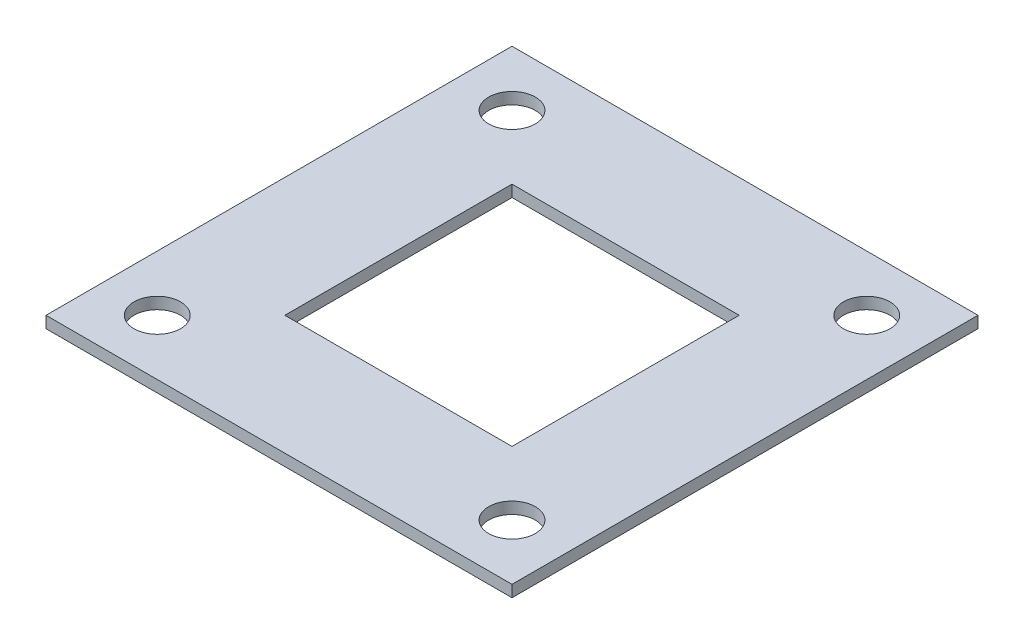
ISO-10303-21;
HEADER;
FILE_DESCRIPTION(('STEP AP214'),'2;1');
FILE_NAME('part.step','',(''),(''),'','','');
FILE_SCHEMA(('AUTOMOTIVE_DESIGN { 1 0 10303 214 1 1 1 1 }'));
ENDSEC;
DATA;
#1=APPLICATION_CONTEXT('core data for automotive mechanical design processes');
#2=APPLICATION_PROTOCOL_DEFINITION('international standard','automotive_design',2000,#1);
#3=PRODUCT_CONTEXT('',#1,'mechanical');
#4=PRODUCT('Part','Part','',(#3));
#5=PRODUCT_RELATED_PRODUCT_CATEGORY('part','',(#4));
#6=PRODUCT_DEFINITION_FORMATION('','',#4);
#7=PRODUCT_DEFINITION_CONTEXT('part definition',#1,'design');
#8=PRODUCT_DEFINITION('design','',#6,#7);
#9=PRODUCT_DEFINITION_SHAPE('','',#8);
#10=(LENGTH_UNIT() NAMED_UNIT(*) SI_UNIT(.MILLI.,.METRE.));
#11=(NAMED_UNIT(*) PLANE_ANGLE_UNIT() SI_UNIT($,.RADIAN.));
#12=(NAMED_UNIT(*) SI_UNIT($,.STERADIAN.) SOLID_ANGLE_UNIT());
#13=UNCERTAINTY_MEASURE_WITH_UNIT(LENGTH_MEASURE(1.E-05),#10,'distance_accuracy_value','');
#14=(GEOMETRIC_REPRESENTATION_CONTEXT(3) GLOBAL_UNCERTAINTY_ASSIGNED_CONTEXT((#13)) GLOBAL_UNIT_ASSIGNED_CONTEXT((#10,
#11,#12)) REPRESENTATION_CONTEXT('',''));
#15=CARTESIAN_POINT('',(0.,0.,0.));
#16=DIRECTION('',(0.,0.,1.));
#17=DIRECTION('',(1.,0.,0.));
#18=AXIS2_PLACEMENT_3D('',#15,#16,#17);
#19=CARTESIAN_POINT('',(-20.,1.,20.));
#20=DIRECTION('',(0.,0.,-1.));
#21=DIRECTION('',(-1.,0.,0.));
#22=AXIS2_PLACEMENT_3D('',#19,#20,#21);
#23=PLANE('',#22);
#24=DIRECTION('',(1.,0.,0.));
#25=VECTOR('',#24,1.);
#26=CARTESIAN_POINT('',(-20.,0.,20.));
#27=LINE('',#26,#25);
#28=CARTESIAN_POINT('',(-20.,0.,20.));
#29=VERTEX_POINT('',#28);
#30=CARTESIAN_POINT('',(20.,0.,20.));
#31=VERTEX_POINT('',#30);
#32=EDGE_CURVE('E185',#29,#31,#27,.T.);
#33=ORIENTED_EDGE('',*,*,#32,.T.);
#34=DIRECTION('',(0.,-1.,0.));
#35=VECTOR('',#34,1.);
#36=CARTESIAN_POINT('',(20.,1.,20.));
#37=LINE('',#36,#35);
#38=CARTESIAN_POINT('',(20.,1.,20.));
#39=VERTEX_POINT('',#38);
#40=EDGE_CURVE('E11',#39,#31,#37,.T.);
#41=ORIENTED_EDGE('',*,*,#40,.F.);
#42=DIRECTION('',(1.,0.,0.));
#43=VECTOR('',#42,1.);
#44=CARTESIAN_POINT('',(-20.,1.,20.));
#45=LINE('',#44,#43);
#46=CARTESIAN_POINT('',(-20.,1.,20.));
#47=VERTEX_POINT('',#46);
#48=EDGE_CURVE('E186',#47,#39,#45,.T.);
#49=ORIENTED_EDGE('',*,*,#48,.F.);
#50=DIRECTION('',(0.,-1.,0.));
#51=VECTOR('',#50,1.);
#52=CARTESIAN_POINT('',(-20.,1.,20.));
#53=LINE('',#52,#51);
#54=EDGE_CURVE('E202',#47,#29,#53,.T.);
#55=ORIENTED_EDGE('',*,*,#54,.T.);
#56=EDGE_LOOP('',(#33,#41,#49,#55));
#57=FACE_BOUND('',#56,.T.);
#58=ADVANCED_FACE('F41',(#57),#23,.F.);
#59=CARTESIAN_POINT('',(20.,1.,20.));
#60=DIRECTION('',(-1.,0.,0.));
#61=DIRECTION('',(0.,0.,1.));
#62=AXIS2_PLACEMENT_3D('',#59,#60,#61);
#63=PLANE('',#62);
#64=DIRECTION('',(0.,0.,-1.));
#65=VECTOR('',#64,1.);
#66=CARTESIAN_POINT('',(20.,0.,20.));
#67=LINE('',#66,#65);
#68=CARTESIAN_POINT('',(20.,0.,-20.));
#69=VERTEX_POINT('',#68);
#70=EDGE_CURVE('E206',#31,#69,#67,.T.);
#71=ORIENTED_EDGE('',*,*,#70,.T.);
#72=DIRECTION('',(0.,-1.,0.));
#73=VECTOR('',#72,1.);
#74=CARTESIAN_POINT('',(20.,1.,-20.));
#75=LINE('',#74,#73);
#76=CARTESIAN_POINT('',(20.,1.,-20.));
#77=VERTEX_POINT('',#76);
#78=EDGE_CURVE('E49',#77,#69,#75,.T.);
#79=ORIENTED_EDGE('',*,*,#78,.F.);
#80=DIRECTION('',(0.,0.,-1.));
#81=VECTOR('',#80,1.);
#82=CARTESIAN_POINT('',(20.,1.,20.));
#83=LINE('',#82,#81);
#84=EDGE_CURVE('E190',#39,#77,#83,.T.);
#85=ORIENTED_EDGE('',*,*,#84,.F.);
#86=ORIENTED_EDGE('',*,*,#40,.T.);
#87=EDGE_LOOP('',(#71,#79,#85,#86));
#88=FACE_BOUND('',#87,.T.);
#89=ADVANCED_FACE('F228',(#88),#63,.F.);
#90=CARTESIAN_POINT('',(-20.,1.,-20.));
#91=DIRECTION('',(0.,0.,-1.));
#92=DIRECTION('',(-1.,0.,0.));
#93=AXIS2_PLACEMENT_3D('',#90,#91,#92);
#94=PLANE('',#93);
#95=DIRECTION('',(1.,0.,0.));
#96=VECTOR('',#95,1.);
#97=CARTESIAN_POINT('',(-20.,0.,-20.));
#98=LINE('',#97,#96);
#99=CARTESIAN_POINT('',(-20.,0.,-20.));
#100=VERTEX_POINT('',#99);
#101=EDGE_CURVE('E210',#100,#69,#98,.T.);
#102=ORIENTED_EDGE('',*,*,#101,.F.);
#103=DIRECTION('',(0.,-1.,0.));
#104=VECTOR('',#103,1.);
#105=CARTESIAN_POINT('',(-20.,1.,-20.));
#106=LINE('',#105,#104);
#107=CARTESIAN_POINT('',(-20.,1.,-20.));
#108=VERTEX_POINT('',#107);
#109=EDGE_CURVE('E219',#108,#100,#106,.T.);
#110=ORIENTED_EDGE('',*,*,#109,.F.);
#111=DIRECTION('',(1.,0.,0.));
#112=VECTOR('',#111,1.);
#113=CARTESIAN_POINT('',(-20.,1.,-20.));
#114=LINE('',#113,#112);
#115=EDGE_CURVE('E194',#108,#77,#114,.T.);
#116=ORIENTED_EDGE('',*,*,#115,.T.);
#117=ORIENTED_EDGE('',*,*,#78,.T.);
#118=EDGE_LOOP('',(#102,#110,#116,#117));
#119=FACE_BOUND('',#118,.T.);
#120=ADVANCED_FACE('F225',(#119),#94,.T.);
#121=CARTESIAN_POINT('',(-20.,1.,20.));
#122=DIRECTION('',(-1.,0.,0.));
#123=DIRECTION('',(0.,0.,1.));
#124=AXIS2_PLACEMENT_3D('',#121,#122,#123);
#125=PLANE('',#124);
#126=DIRECTION('',(0.,0.,-1.));
#127=VECTOR('',#126,1.);
#128=CARTESIAN_POINT('',(-20.,0.,20.));
#129=LINE('',#128,#127);
#130=EDGE_CURVE('E191',#29,#100,#129,.T.);
#131=ORIENTED_EDGE('',*,*,#130,.F.);
#132=ORIENTED_EDGE('',*,*,#54,.F.);
#133=DIRECTION('',(0.,0.,-1.));
#134=VECTOR('',#133,1.);
#135=CARTESIAN_POINT('',(-20.,1.,20.));
#136=LINE('',#135,#134);
#137=EDGE_CURVE('E198',#47,#108,#136,.T.);
#138=ORIENTED_EDGE('',*,*,#137,.T.);
#139=ORIENTED_EDGE('',*,*,#109,.T.);
#140=EDGE_LOOP('',(#131,#132,#138,#139));
#141=FACE_BOUND('',#140,.T.);
#142=ADVANCED_FACE('F234',(#141),#125,.T.);
#143=CARTESIAN_POINT('',(0.,1.,0.));
#144=DIRECTION('',(0.,1.,0.));
#145=DIRECTION('',(0.,0.,1.));
#146=AXIS2_PLACEMENT_3D('',#143,#144,#145);
#147=PLANE('',#146);
#148=DIRECTION('',(0.,0.,1.));
#149=VECTOR('',#148,1.);
#150=CARTESIAN_POINT('',(-9.75,1.,0.));
#151=LINE('',#150,#149);
#152=CARTESIAN_POINT('',(-9.75,0.999999999999999,-9.75));
#153=VERTEX_POINT('',#152);
#154=CARTESIAN_POINT('',(-9.75,0.999999999999999,9.75));
#155=VERTEX_POINT('',#154);
#156=EDGE_CURVE('E150',#153,#155,#151,.T.);
#157=ORIENTED_EDGE('',*,*,#156,.F.);
#158=DIRECTION('',(-1.,0.,0.));
#159=VECTOR('',#158,1.);
#160=CARTESIAN_POINT('',(0.,1.,-9.75));
#161=LINE('',#160,#159);
#162=CARTESIAN_POINT('',(9.75,1.,-9.75));
#163=VERTEX_POINT('',#162);
#164=EDGE_CURVE('E137',#163,#153,#161,.T.);
#165=ORIENTED_EDGE('',*,*,#164,.F.);
#166=DIRECTION('',(0.,0.,1.));
#167=VECTOR('',#166,1.);
#168=CARTESIAN_POINT('',(9.75,1.,0.));
#169=LINE('',#168,#167);
#170=CARTESIAN_POINT('',(9.75,0.999999999999999,9.75));
#171=VERTEX_POINT('',#170);
#172=EDGE_CURVE('E112',#163,#171,#169,.T.);
#173=ORIENTED_EDGE('',*,*,#172,.T.);
#174=DIRECTION('',(-1.,0.,0.));
#175=VECTOR('',#174,1.);
#176=CARTESIAN_POINT('',(0.,1.,9.75));
#177=LINE('',#176,#175);
#178=EDGE_CURVE('E146',#171,#155,#177,.T.);
#179=ORIENTED_EDGE('',*,*,#178,.T.);
#180=EDGE_LOOP('',(#157,#165,#173,#179));
#181=FACE_BOUND('',#180,.T.);
#182=CARTESIAN_POINT('',(-15.2247989874837,0.999999999999999,15.2247989874837));
#183=DIRECTION('',(0.,1.,0.));
#184=DIRECTION('',(0.,0.,1.));
#185=AXIS2_PLACEMENT_3D('',#182,#183,#184);
#186=CIRCLE('',#185,2.);
#187=CARTESIAN_POINT('',(-15.2247989874837,0.999999999999999,17.2247989874837));
#188=VERTEX_POINT('',#187);
#189=EDGE_CURVE('E181',#188,#188,#186,.F.);
#190=ORIENTED_EDGE('',*,*,#189,.T.);
#191=EDGE_LOOP('',(#190));
#192=FACE_BOUND('',#191,.T.);
#193=CARTESIAN_POINT('',(-15.2247989874837,0.999999999999999,-15.2247989874837));
#194=DIRECTION('',(0.,1.,0.));
#195=DIRECTION('',(0.,0.,1.));
#196=AXIS2_PLACEMENT_3D('',#193,#194,#195);
#197=CIRCLE('',#196,2.);
#198=CARTESIAN_POINT('',(-15.2247989874837,0.999999999999999,-13.2247989874837));
#199=VERTEX_POINT('',#198);
#200=EDGE_CURVE('E177',#199,#199,#197,.F.);
#201=ORIENTED_EDGE('',*,*,#200,.T.);
#202=EDGE_LOOP('',(#201));
#203=FACE_BOUND('',#202,.T.);
#204=CARTESIAN_POINT('',(15.2247989874837,0.999999999999999,-15.2247989874837));
#205=DIRECTION('',(0.,1.,0.));
#206=DIRECTION('',(0.,0.,1.));
#207=AXIS2_PLACEMENT_3D('',#204,#205,#206);
#208=CIRCLE('',#207,2.);
#209=CARTESIAN_POINT('',(15.2247989874837,0.999999999999999,-13.2247989874837));
#210=VERTEX_POINT('',#209);
#211=EDGE_CURVE('E173',#210,#210,#208,.F.);
#212=ORIENTED_EDGE('',*,*,#211,.T.);
#213=EDGE_LOOP('',(#212));
#214=FACE_BOUND('',#213,.T.);
#215=CARTESIAN_POINT('',(15.2247989874837,0.999999999999999,15.2247989874837));
#216=DIRECTION('',(0.,1.,0.));
#217=DIRECTION('',(0.,0.,1.));
#218=AXIS2_PLACEMENT_3D('',#215,#216,#217);
#219=CIRCLE('',#218,2.);
#220=CARTESIAN_POINT('',(15.2247989874837,0.999999999999999,17.2247989874837));
#221=VERTEX_POINT('',#220);
#222=EDGE_CURVE('E169',#221,#221,#219,.F.);
#223=ORIENTED_EDGE('',*,*,#222,.T.);
#224=EDGE_LOOP('',(#223));
#225=FACE_BOUND('',#224,.T.);
#226=ORIENTED_EDGE('',*,*,#48,.T.);
#227=ORIENTED_EDGE('',*,*,#84,.T.);
#228=ORIENTED_EDGE('',*,*,#115,.F.);
#229=ORIENTED_EDGE('',*,*,#137,.F.);
#230=EDGE_LOOP('',(#226,#227,#228,#229));
#231=FACE_BOUND('',#230,.T.);
#232=ADVANCED_FACE('F238',(#181,#192,#203,#214,#225,#231),#147,.T.);
#233=CARTESIAN_POINT('',(0.,0.,0.));
#234=DIRECTION('',(0.,1.,0.));
#235=DIRECTION('',(0.,0.,1.));
#236=AXIS2_PLACEMENT_3D('',#233,#234,#235);
#237=PLANE('',#236);
#238=DIRECTION('',(1.,0.,0.));
#239=VECTOR('',#238,1.);
#240=CARTESIAN_POINT('',(-9.75,0.,-9.75));
#241=LINE('',#240,#239);
#242=CARTESIAN_POINT('',(-9.75,0.,-9.75));
#243=VERTEX_POINT('',#242);
#244=CARTESIAN_POINT('',(9.75,0.,-9.75));
#245=VERTEX_POINT('',#244);
#246=EDGE_CURVE('E119',#243,#245,#241,.T.);
#247=ORIENTED_EDGE('',*,*,#246,.F.);
#248=DIRECTION('',(0.,0.,-1.));
#249=VECTOR('',#248,1.);
#250=CARTESIAN_POINT('',(-9.75,0.,9.75));
#251=LINE('',#250,#249);
#252=CARTESIAN_POINT('',(-9.75,0.,9.75));
#253=VERTEX_POINT('',#252);
#254=EDGE_CURVE('E64',#253,#243,#251,.T.);
#255=ORIENTED_EDGE('',*,*,#254,.F.);
#256=DIRECTION('',(1.,0.,0.));
#257=VECTOR('',#256,1.);
#258=CARTESIAN_POINT('',(-9.75,0.,9.75));
#259=LINE('',#258,#257);
#260=CARTESIAN_POINT('',(9.75,0.,9.75));
#261=VERTEX_POINT('',#260);
#262=EDGE_CURVE('E127',#253,#261,#259,.T.);
#263=ORIENTED_EDGE('',*,*,#262,.T.);
#264=DIRECTION('',(0.,0.,-1.));
#265=VECTOR('',#264,1.);
#266=CARTESIAN_POINT('',(9.75,0.,9.75));
#267=LINE('',#266,#265);
#268=EDGE_CURVE('E109',#261,#245,#267,.T.);
#269=ORIENTED_EDGE('',*,*,#268,.T.);
#270=EDGE_LOOP('',(#247,#255,#263,#269));
#271=FACE_BOUND('',#270,.T.);
#272=CARTESIAN_POINT('',(-15.2247989874837,0.,15.2247989874837));
#273=DIRECTION('',(0.,1.,0.));
#274=DIRECTION('',(0.,0.,1.));
#275=AXIS2_PLACEMENT_3D('',#272,#273,#274);
#276=CIRCLE('',#275,2.);
#277=CARTESIAN_POINT('',(-15.2247989874837,0.,17.2247989874837));
#278=VERTEX_POINT('',#277);
#279=EDGE_CURVE('E153',#278,#278,#276,.T.);
#280=ORIENTED_EDGE('',*,*,#279,.T.);
#281=EDGE_LOOP('',(#280));
#282=FACE_BOUND('',#281,.T.);
#283=CARTESIAN_POINT('',(-15.2247989874837,0.,-15.2247989874837));
#284=DIRECTION('',(0.,1.,0.));
#285=DIRECTION('',(0.,0.,1.));
#286=AXIS2_PLACEMENT_3D('',#283,#284,#285);
#287=CIRCLE('',#286,2.);
#288=CARTESIAN_POINT('',(-15.2247989874837,0.,-13.2247989874837));
#289=VERTEX_POINT('',#288);
#290=EDGE_CURVE('E159',#289,#289,#287,.T.);
#291=ORIENTED_EDGE('',*,*,#290,.T.);
#292=EDGE_LOOP('',(#291));
#293=FACE_BOUND('',#292,.T.);
#294=CARTESIAN_POINT('',(15.2247989874837,0.,-15.2247989874837));
#295=DIRECTION('',(0.,1.,0.));
#296=DIRECTION('',(0.,0.,1.));
#297=AXIS2_PLACEMENT_3D('',#294,#295,#296);
#298=CIRCLE('',#297,2.);
#299=CARTESIAN_POINT('',(15.2247989874837,0.,-13.2247989874837));
#300=VERTEX_POINT('',#299);
#301=EDGE_CURVE('E154',#300,#300,#298,.T.);
#302=ORIENTED_EDGE('',*,*,#301,.T.);
#303=EDGE_LOOP('',(#302));
#304=FACE_BOUND('',#303,.T.);
#305=CARTESIAN_POINT('',(15.2247989874837,0.,15.2247989874837));
#306=DIRECTION('',(0.,1.,0.));
#307=DIRECTION('',(0.,0.,1.));
#308=AXIS2_PLACEMENT_3D('',#305,#306,#307);
#309=CIRCLE('',#308,2.);
#310=CARTESIAN_POINT('',(15.2247989874837,0.,17.2247989874837));
#311=VERTEX_POINT('',#310);
#312=EDGE_CURVE('E158',#311,#311,#309,.T.);
#313=ORIENTED_EDGE('',*,*,#312,.T.);
#314=EDGE_LOOP('',(#313));
#315=FACE_BOUND('',#314,.T.);
#316=ORIENTED_EDGE('',*,*,#32,.F.);
#317=ORIENTED_EDGE('',*,*,#130,.T.);
#318=ORIENTED_EDGE('',*,*,#101,.T.);
#319=ORIENTED_EDGE('',*,*,#70,.F.);
#320=EDGE_LOOP('',(#316,#317,#318,#319));
#321=FACE_BOUND('',#320,.T.);
#322=ADVANCED_FACE('F124',(#271,#282,#293,#304,#315,#321),#237,.F.);
#323=CARTESIAN_POINT('',(15.2247989874837,10.,15.2247989874837));
#324=DIRECTION('',(0.,-1.,0.));
#325=DIRECTION('',(0.,0.,-1.));
#326=AXIS2_PLACEMENT_3D('',#323,#324,#325);
#327=CYLINDRICAL_SURFACE('',#326,2.);
#328=ORIENTED_EDGE('',*,*,#222,.F.);
#329=EDGE_LOOP('',(#328));
#330=FACE_BOUND('',#329,.T.);
#331=ORIENTED_EDGE('',*,*,#312,.F.);
#332=EDGE_LOOP('',(#331));
#333=FACE_BOUND('',#332,.T.);
#334=ADVANCED_FACE('F253',(#330,#333),#327,.F.);
#335=CARTESIAN_POINT('',(15.2247989874837,10.,-15.2247989874837));
#336=DIRECTION('',(0.,-1.,0.));
#337=DIRECTION('',(0.,0.,-1.));
#338=AXIS2_PLACEMENT_3D('',#335,#336,#337);
#339=CYLINDRICAL_SURFACE('',#338,2.);
#340=ORIENTED_EDGE('',*,*,#211,.F.);
#341=EDGE_LOOP('',(#340));
#342=FACE_BOUND('',#341,.T.);
#343=ORIENTED_EDGE('',*,*,#301,.F.);
#344=EDGE_LOOP('',(#343));
#345=FACE_BOUND('',#344,.T.);
#346=ADVANCED_FACE('F259',(#342,#345),#339,.F.);
#347=CARTESIAN_POINT('',(-15.2247989874837,10.,-15.2247989874837));
#348=DIRECTION('',(0.,-1.,0.));
#349=DIRECTION('',(0.,0.,-1.));
#350=AXIS2_PLACEMENT_3D('',#347,#348,#349);
#351=CYLINDRICAL_SURFACE('',#350,2.);
#352=ORIENTED_EDGE('',*,*,#200,.F.);
#353=EDGE_LOOP('',(#352));
#354=FACE_BOUND('',#353,.T.);
#355=ORIENTED_EDGE('',*,*,#290,.F.);
#356=EDGE_LOOP('',(#355));
#357=FACE_BOUND('',#356,.T.);
#358=ADVANCED_FACE('F265',(#354,#357),#351,.F.);
#359=CARTESIAN_POINT('',(-15.2247989874837,10.,15.2247989874837));
#360=DIRECTION('',(0.,-1.,0.));
#361=DIRECTION('',(0.,0.,-1.));
#362=AXIS2_PLACEMENT_3D('',#359,#360,#361);
#363=CYLINDRICAL_SURFACE('',#362,2.);
#364=ORIENTED_EDGE('',*,*,#189,.F.);
#365=EDGE_LOOP('',(#364));
#366=FACE_BOUND('',#365,.T.);
#367=ORIENTED_EDGE('',*,*,#279,.F.);
#368=EDGE_LOOP('',(#367));
#369=FACE_BOUND('',#368,.T.);
#370=ADVANCED_FACE('F261',(#366,#369),#363,.F.);
#371=CARTESIAN_POINT('',(-9.75,10.,9.75));
#372=DIRECTION('',(-1.,0.,0.));
#373=DIRECTION('',(0.,0.,1.));
#374=AXIS2_PLACEMENT_3D('',#371,#372,#373);
#375=PLANE('',#374);
#376=ORIENTED_EDGE('',*,*,#156,.T.);
#377=DIRECTION('',(0.,-1.,0.));
#378=VECTOR('',#377,1.);
#379=CARTESIAN_POINT('',(-9.75,10.,9.75));
#380=LINE('',#379,#378);
#381=EDGE_CURVE('E134',#155,#253,#380,.T.);
#382=ORIENTED_EDGE('',*,*,#381,.T.);
#383=ORIENTED_EDGE('',*,*,#254,.T.);
#384=DIRECTION('',(0.,-1.,0.));
#385=VECTOR('',#384,1.);
#386=CARTESIAN_POINT('',(-9.75,10.,-9.75));
#387=LINE('',#386,#385);
#388=EDGE_CURVE('E116',#153,#243,#387,.T.);
#389=ORIENTED_EDGE('',*,*,#388,.F.);
#390=EDGE_LOOP('',(#376,#382,#383,#389));
#391=FACE_BOUND('',#390,.T.);
#392=ADVANCED_FACE('F264',(#391),#375,.F.);
#393=CARTESIAN_POINT('',(-9.75,10.,9.75));
#394=DIRECTION('',(0.,0.,-1.));
#395=DIRECTION('',(-1.,0.,0.));
#396=AXIS2_PLACEMENT_3D('',#393,#394,#395);
#397=PLANE('',#396);
#398=DIRECTION('',(0.,-1.,0.));
#399=VECTOR('',#398,1.);
#400=CARTESIAN_POINT('',(9.75,10.,9.75));
#401=LINE('',#400,#399);
#402=EDGE_CURVE('E115',#171,#261,#401,.T.);
#403=ORIENTED_EDGE('',*,*,#402,.T.);
#404=ORIENTED_EDGE('',*,*,#262,.F.);
#405=ORIENTED_EDGE('',*,*,#381,.F.);
#406=ORIENTED_EDGE('',*,*,#178,.F.);
#407=EDGE_LOOP('',(#403,#404,#405,#406));
#408=FACE_BOUND('',#407,.T.);
#409=ADVANCED_FACE('F275',(#408),#397,.T.);
#410=CARTESIAN_POINT('',(9.75,10.,9.75));
#411=DIRECTION('',(-1.,0.,0.));
#412=DIRECTION('',(0.,0.,1.));
#413=AXIS2_PLACEMENT_3D('',#410,#411,#412);
#414=PLANE('',#413);
#415=DIRECTION('',(0.,-1.,0.));
#416=VECTOR('',#415,1.);
#417=CARTESIAN_POINT('',(9.75,10.,-9.75));
#418=LINE('',#417,#416);
#419=EDGE_CURVE('E56',#163,#245,#418,.T.);
#420=ORIENTED_EDGE('',*,*,#419,.T.);
#421=ORIENTED_EDGE('',*,*,#268,.F.);
#422=ORIENTED_EDGE('',*,*,#402,.F.);
#423=ORIENTED_EDGE('',*,*,#172,.F.);
#424=EDGE_LOOP('',(#420,#421,#422,#423));
#425=FACE_BOUND('',#424,.T.);
#426=ADVANCED_FACE('F106',(#425),#414,.T.);
#427=CARTESIAN_POINT('',(-9.75,10.,-9.75));
#428=DIRECTION('',(0.,0.,-1.));
#429=DIRECTION('',(-1.,0.,0.));
#430=AXIS2_PLACEMENT_3D('',#427,#428,#429);
#431=PLANE('',#430);
#432=ORIENTED_EDGE('',*,*,#164,.T.);
#433=ORIENTED_EDGE('',*,*,#388,.T.);
#434=ORIENTED_EDGE('',*,*,#246,.T.);
#435=ORIENTED_EDGE('',*,*,#419,.F.);
#436=EDGE_LOOP('',(#432,#433,#434,#435));
#437=FACE_BOUND('',#436,.T.);
#438=ADVANCED_FACE('F120',(#437),#431,.F.);
#439=CLOSED_SHELL('',(#58,#89,#120,#142,#232,#322,#334,#346,#358,#370,#392,#409,#426,#438));
#440=MANIFOLD_SOLID_BREP('B2',#439);
#441=ADVANCED_BREP_SHAPE_REPRESENTATION('',(#18,#440),#14);
#442=SHAPE_DEFINITION_REPRESENTATION(#9,#441);
ENDSEC;
END-ISO-10303-21;
